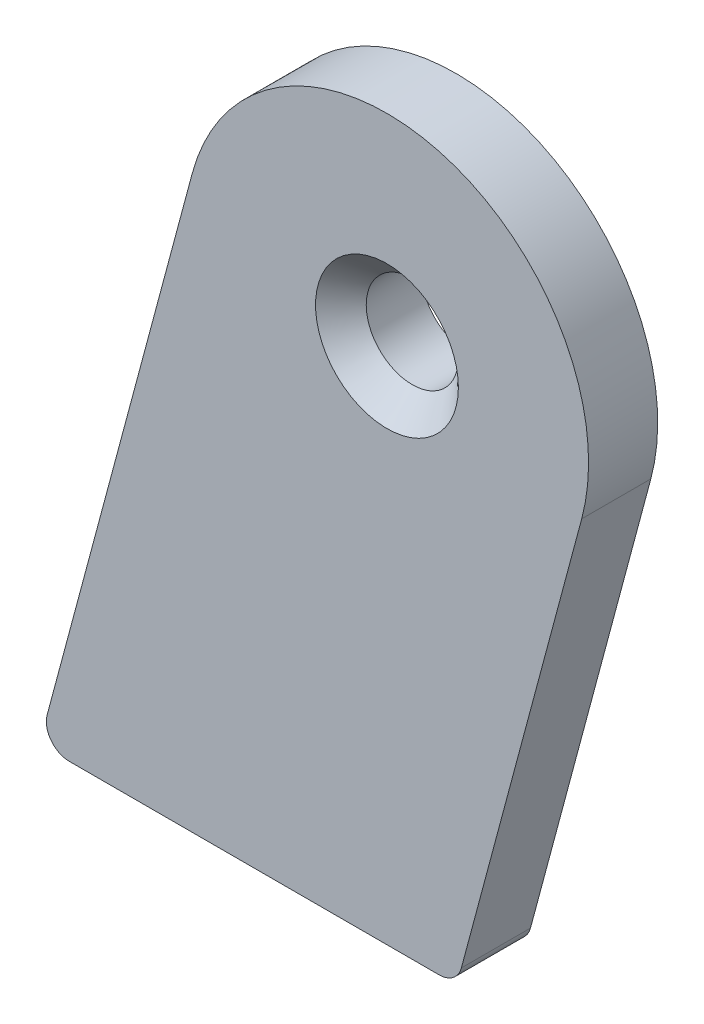
ISO-10303-21;
HEADER;
FILE_DESCRIPTION(('STEP AP214'),'2;1');
FILE_NAME('part.step','',(''),(''),'','','');
FILE_SCHEMA(('AUTOMOTIVE_DESIGN { 1 0 10303 214 1 1 1 1 }'));
ENDSEC;
DATA;
#1=APPLICATION_CONTEXT('core data for automotive mechanical design processes');
#2=APPLICATION_PROTOCOL_DEFINITION('international standard','automotive_design',2000,#1);
#3=PRODUCT_CONTEXT('',#1,'mechanical');
#4=PRODUCT('Part','Part','',(#3));
#5=PRODUCT_RELATED_PRODUCT_CATEGORY('part','',(#4));
#6=PRODUCT_DEFINITION_FORMATION('','',#4);
#7=PRODUCT_DEFINITION_CONTEXT('part definition',#1,'design');
#8=PRODUCT_DEFINITION('design','',#6,#7);
#9=PRODUCT_DEFINITION_SHAPE('','',#8);
#10=(LENGTH_UNIT() NAMED_UNIT(*) SI_UNIT(.MILLI.,.METRE.));
#11=(NAMED_UNIT(*) PLANE_ANGLE_UNIT() SI_UNIT($,.RADIAN.));
#12=(NAMED_UNIT(*) SI_UNIT($,.STERADIAN.) SOLID_ANGLE_UNIT());
#13=UNCERTAINTY_MEASURE_WITH_UNIT(LENGTH_MEASURE(1.E-05),#10,'distance_accuracy_value','');
#14=(GEOMETRIC_REPRESENTATION_CONTEXT(3) GLOBAL_UNCERTAINTY_ASSIGNED_CONTEXT((#13)) GLOBAL_UNIT_ASSIGNED_CONTEXT((#10,
#11,#12)) REPRESENTATION_CONTEXT('',''));
#15=CARTESIAN_POINT('',(0.,0.,0.));
#16=DIRECTION('',(0.,0.,1.));
#17=DIRECTION('',(1.,0.,0.));
#18=AXIS2_PLACEMENT_3D('',#15,#16,#17);
#19=CARTESIAN_POINT('',(46.,0.,28.));
#20=DIRECTION('',(0.,0.,-1.));
#21=DIRECTION('',(-1.,0.,0.));
#22=AXIS2_PLACEMENT_3D('',#19,#20,#21);
#23=PLANE('',#22);
#24=DIRECTION('',(0.258819045102514,0.96592582628907,0.));
#25=VECTOR('',#24,1.);
#26=CARTESIAN_POINT('',(58.0596194977762,-45.,28.));
#27=LINE('',#26,#25);
#28=CARTESIAN_POINT('',(58.4568171743964,-43.517638090205,28.));
#29=VERTEX_POINT('',#28);
#30=CARTESIAN_POINT('',(68.9037019600588,-4.529333289294,28.));
#31=VERTEX_POINT('',#30);
#32=EDGE_CURVE('E191',#29,#31,#27,.T.);
#33=ORIENTED_EDGE('',*,*,#32,.F.);
#34=CARTESIAN_POINT('',(56.5249655218183,-43.,28.));
#35=DIRECTION('',(0.,0.,-1.));
#36=DIRECTION('',(-1.,0.,0.));
#37=AXIS2_PLACEMENT_3D('',#34,#35,#36);
#38=CIRCLE('',#37,2.);
#39=CARTESIAN_POINT('',(56.5249655218183,-45.,28.));
#40=VERTEX_POINT('',#39);
#41=EDGE_CURVE('E221',#29,#40,#38,.T.);
#42=ORIENTED_EDGE('',*,*,#41,.T.);
#43=DIRECTION('',(1.,0.,0.));
#44=VECTOR('',#43,1.);
#45=CARTESIAN_POINT('',(21.8249531834234,-45.,28.));
#46=LINE('',#45,#44);
#47=CARTESIAN_POINT('',(24.4314039291058,-45.,28.));
#48=VERTEX_POINT('',#47);
#49=EDGE_CURVE('E301',#48,#40,#46,.T.);
#50=ORIENTED_EDGE('',*,*,#49,.F.);
#51=CARTESIAN_POINT('',(24.4314039291058,-43.,28.));
#52=DIRECTION('',(0.,0.,-1.));
#53=DIRECTION('',(-1.,0.,0.));
#54=AXIS2_PLACEMENT_3D('',#51,#52,#53);
#55=CIRCLE('',#54,2.);
#56=CARTESIAN_POINT('',(22.4995522765276,-42.482361909795,28.));
#57=VERTEX_POINT('',#56);
#58=EDGE_CURVE('E219',#48,#57,#55,.T.);
#59=ORIENTED_EDGE('',*,*,#58,.T.);
#60=DIRECTION('',(-0.258819045102514,-0.96592582628907,0.));
#61=VECTOR('',#60,1.);
#62=CARTESIAN_POINT('',(35.0962980399413,4.529333289294,28.));
#63=LINE('',#62,#61);
#64=CARTESIAN_POINT('',(35.0962980399413,4.529333289294,28.));
#65=VERTEX_POINT('',#64);
#66=EDGE_CURVE('E194',#65,#57,#63,.T.);
#67=ORIENTED_EDGE('',*,*,#66,.F.);
#68=CARTESIAN_POINT('',(52.,0.,28.));
#69=DIRECTION('',(0.,0.,-1.));
#70=DIRECTION('',(-1.,0.,0.));
#71=AXIS2_PLACEMENT_3D('',#68,#69,#70);
#72=CIRCLE('',#71,17.5);
#73=EDGE_CURVE('E164',#65,#31,#72,.T.);
#74=ORIENTED_EDGE('',*,*,#73,.T.);
#75=EDGE_LOOP('',(#33,#42,#50,#59,#67,#74));
#76=FACE_BOUND('',#75,.T.);
#77=CARTESIAN_POINT('',(52.,0.,28.));
#78=DIRECTION('',(0.,0.,-1.));
#79=DIRECTION('',(-1.,0.,0.));
#80=AXIS2_PLACEMENT_3D('',#77,#78,#79);
#81=CIRCLE('',#80,6.00000000000001);
#82=CARTESIAN_POINT('',(46.,0.,28.));
#83=VERTEX_POINT('',#82);
#84=EDGE_CURVE('E198',#83,#83,#81,.T.);
#85=ORIENTED_EDGE('',*,*,#84,.F.);
#86=EDGE_LOOP('',(#85));
#87=FACE_BOUND('',#86,.T.);
#88=DIRECTION('',(-0.60876142900872,0.793353340291236,0.));
#89=VECTOR('',#88,1.);
#90=CARTESIAN_POINT('',(59.155963733759,-12.6111927683755,28.));
#91=LINE('',#90,#89);
#92=CARTESIAN_POINT('',(58.886893794168,-12.2605339960317,28.));
#93=VERTEX_POINT('',#92);
#94=CARTESIAN_POINT('',(58.2743340974937,-11.4622306569458,28.));
#95=VERTEX_POINT('',#94);
#96=EDGE_CURVE('E270',#93,#95,#91,.T.);
#97=ORIENTED_EDGE('',*,*,#96,.F.);
#98=CARTESIAN_POINT('',(59.2835704643137,-11.9561532815274,28.));
#99=DIRECTION('',(0.,0.,-1.));
#100=DIRECTION('',(-1.,0.,0.));
#101=AXIS2_PLACEMENT_3D('',#98,#99,#100);
#102=CIRCLE('',#101,0.5);
#103=CARTESIAN_POINT('',(59.5436979808963,-12.3831587558676,28.));
#104=VERTEX_POINT('',#103);
#105=EDGE_CURVE('E257',#93,#104,#102,.F.);
#106=ORIENTED_EDGE('',*,*,#105,.T.);
#107=CARTESIAN_POINT('',(52.,0.,28.));
#108=DIRECTION('',(0.,0.,-1.));
#109=DIRECTION('',(-1.,0.,0.));
#110=AXIS2_PLACEMENT_3D('',#107,#108,#109);
#111=CIRCLE('',#110,14.5);
#112=CARTESIAN_POINT('',(62.0087601453726,-10.4916500300191,28.));
#113=VERTEX_POINT('',#112);
#114=EDGE_CURVE('E294',#113,#104,#111,.T.);
#115=ORIENTED_EDGE('',*,*,#114,.F.);
#116=CARTESIAN_POINT('',(61.6636304851874,-10.1298689945012,28.));
#117=DIRECTION('',(0.,0.,-1.));
#118=DIRECTION('',(-1.,0.,0.));
#119=AXIS2_PLACEMENT_3D('',#116,#117,#118);
#120=CIRCLE('',#119,0.5);
#121=CARTESIAN_POINT('',(62.060307155333,-9.82548827999685,28.));
#122=VERTEX_POINT('',#121);
#123=EDGE_CURVE('E11',#113,#122,#120,.F.);
#124=ORIENTED_EDGE('',*,*,#123,.T.);
#125=DIRECTION('',(0.60876142900872,-0.793353340291236,0.));
#126=VECTOR('',#125,1.);
#127=CARTESIAN_POINT('',(62.3293770949239,-10.1761470523406,28.));
#128=LINE('',#127,#126);
#129=CARTESIAN_POINT('',(61.4477474586586,-9.02718494091091,28.));
#130=VERTEX_POINT('',#129);
#131=EDGE_CURVE('E264',#130,#122,#128,.T.);
#132=ORIENTED_EDGE('',*,*,#131,.F.);
#133=CARTESIAN_POINT('',(61.051070788513,-9.33156565541528,28.));
#134=DIRECTION('',(0.,0.,-1.));
#135=DIRECTION('',(-1.,0.,0.));
#136=AXIS2_PLACEMENT_3D('',#133,#134,#135);
#137=CIRCLE('',#136,0.5);
#138=CARTESIAN_POINT('',(60.7029526812625,-8.97265928405315,28.));
#139=VERTEX_POINT('',#138);
#140=EDGE_CURVE('E55',#130,#139,#137,.F.);
#141=ORIENTED_EDGE('',*,*,#140,.T.);
#142=CARTESIAN_POINT('',(52.,0.,28.));
#143=DIRECTION('',(0.,0.,1.));
#144=DIRECTION('',(-1.,0.,0.));
#145=AXIS2_PLACEMENT_3D('',#142,#143,#144);
#146=CIRCLE('',#145,12.5);
#147=CARTESIAN_POINT('',(58.4144334304224,-10.7287018677321,28.));
#148=VERTEX_POINT('',#147);
#149=EDGE_CURVE('E263',#148,#139,#146,.T.);
#150=ORIENTED_EDGE('',*,*,#149,.F.);
#151=CARTESIAN_POINT('',(58.6710107676393,-11.1578499424414,28.));
#152=DIRECTION('',(0.,0.,-1.));
#153=DIRECTION('',(-1.,0.,0.));
#154=AXIS2_PLACEMENT_3D('',#151,#152,#153);
#155=CIRCLE('',#154,0.5);
#156=EDGE_CURVE('E259',#148,#95,#155,.F.);
#157=ORIENTED_EDGE('',*,*,#156,.T.);
#158=EDGE_LOOP('',(#97,#106,#115,#124,#132,#141,#150,#157));
#159=FACE_BOUND('',#158,.T.);
#160=ADVANCED_FACE('F47',(#76,#87,#159),#23,.T.);
#161=CARTESIAN_POINT('',(52.,0.,28.));
#162=DIRECTION('',(0.,0.,-1.));
#163=DIRECTION('',(-1.,0.,0.));
#164=AXIS2_PLACEMENT_3D('',#161,#162,#163);
#165=CYLINDRICAL_SURFACE('',#164,17.5);
#166=ORIENTED_EDGE('',*,*,#73,.F.);
#167=DIRECTION('',(0.,0.,1.));
#168=VECTOR('',#167,1.);
#169=CARTESIAN_POINT('',(35.0962980399413,4.529333289294,28.));
#170=LINE('',#169,#168);
#171=CARTESIAN_POINT('',(35.0962980399413,4.529333289294,34.));
#172=VERTEX_POINT('',#171);
#173=EDGE_CURVE('E165',#65,#172,#170,.T.);
#174=ORIENTED_EDGE('',*,*,#173,.T.);
#175=CARTESIAN_POINT('',(52.,0.,34.));
#176=DIRECTION('',(0.,0.,-1.));
#177=DIRECTION('',(-1.,0.,0.));
#178=AXIS2_PLACEMENT_3D('',#175,#176,#177);
#179=CIRCLE('',#178,17.5);
#180=CARTESIAN_POINT('',(68.9037019600587,-4.529333289294,34.));
#181=VERTEX_POINT('',#180);
#182=EDGE_CURVE('E153',#172,#181,#179,.T.);
#183=ORIENTED_EDGE('',*,*,#182,.T.);
#184=DIRECTION('',(0.,0.,1.));
#185=VECTOR('',#184,1.);
#186=CARTESIAN_POINT('',(68.9037019600587,-4.529333289294,28.));
#187=LINE('',#186,#185);
#188=EDGE_CURVE('E173',#31,#181,#187,.T.);
#189=ORIENTED_EDGE('',*,*,#188,.F.);
#190=EDGE_LOOP('',(#166,#174,#183,#189));
#191=FACE_BOUND('',#190,.T.);
#192=ADVANCED_FACE('F168',(#191),#165,.T.);
#193=CARTESIAN_POINT('',(48.,0.,27.));
#194=DIRECTION('',(0.,0.,-1.));
#195=DIRECTION('',(-1.,0.,0.));
#196=AXIS2_PLACEMENT_3D('',#193,#194,#195);
#197=PLANE('',#196);
#198=CARTESIAN_POINT('',(52.,0.,27.));
#199=DIRECTION('',(0.,0.,-1.));
#200=DIRECTION('',(-1.,0.,0.));
#201=AXIS2_PLACEMENT_3D('',#198,#199,#200);
#202=CIRCLE('',#201,6.00000000000001);
#203=CARTESIAN_POINT('',(46.,0.,27.));
#204=VERTEX_POINT('',#203);
#205=EDGE_CURVE('E201',#204,#204,#202,.T.);
#206=ORIENTED_EDGE('',*,*,#205,.T.);
#207=EDGE_LOOP('',(#206));
#208=FACE_BOUND('',#207,.T.);
#209=CARTESIAN_POINT('',(52.,0.,27.));
#210=DIRECTION('',(0.,0.,-1.));
#211=DIRECTION('',(-1.,0.,0.));
#212=AXIS2_PLACEMENT_3D('',#209,#210,#211);
#213=CIRCLE('',#212,4.00000000000001);
#214=CARTESIAN_POINT('',(48.,0.,27.));
#215=VERTEX_POINT('',#214);
#216=EDGE_CURVE('E204',#215,#215,#213,.T.);
#217=ORIENTED_EDGE('',*,*,#216,.F.);
#218=EDGE_LOOP('',(#217));
#219=FACE_BOUND('',#218,.T.);
#220=ADVANCED_FACE('F337',(#208,#219),#197,.T.);
#221=CARTESIAN_POINT('',(52.,0.,28.));
#222=DIRECTION('',(0.,0.,-1.));
#223=DIRECTION('',(-1.,0.,0.));
#224=AXIS2_PLACEMENT_3D('',#221,#222,#223);
#225=CYLINDRICAL_SURFACE('',#224,6.00000000000001);
#226=ORIENTED_EDGE('',*,*,#84,.T.);
#227=EDGE_LOOP('',(#226));
#228=FACE_BOUND('',#227,.T.);
#229=ORIENTED_EDGE('',*,*,#205,.F.);
#230=EDGE_LOOP('',(#229));
#231=FACE_BOUND('',#230,.T.);
#232=ADVANCED_FACE('F341',(#228,#231),#225,.T.);
#233=CARTESIAN_POINT('',(34.5,0.,34.));
#234=DIRECTION('',(0.,0.,1.));
#235=DIRECTION('',(1.,0.,0.));
#236=AXIS2_PLACEMENT_3D('',#233,#234,#235);
#237=PLANE('',#236);
#238=CARTESIAN_POINT('',(52.,0.,34.));
#239=DIRECTION('',(0.,0.,1.));
#240=DIRECTION('',(1.,0.,0.));
#241=AXIS2_PLACEMENT_3D('',#238,#239,#240);
#242=CIRCLE('',#241,6.2);
#243=CARTESIAN_POINT('',(58.2,0.,34.));
#244=VERTEX_POINT('',#243);
#245=EDGE_CURVE('E188',#244,#244,#242,.T.);
#246=ORIENTED_EDGE('',*,*,#245,.F.);
#247=EDGE_LOOP('',(#246));
#248=FACE_BOUND('',#247,.T.);
#249=DIRECTION('',(1.,0.,0.));
#250=VECTOR('',#249,1.);
#251=CARTESIAN_POINT('',(21.8249531834234,-45.,34.));
#252=LINE('',#251,#250);
#253=CARTESIAN_POINT('',(24.4314039291058,-45.,34.));
#254=VERTEX_POINT('',#253);
#255=CARTESIAN_POINT('',(56.5249655218183,-45.,34.));
#256=VERTEX_POINT('',#255);
#257=EDGE_CURVE('E180',#254,#256,#252,.T.);
#258=ORIENTED_EDGE('',*,*,#257,.T.);
#259=CARTESIAN_POINT('',(56.5249655218183,-43.,34.));
#260=DIRECTION('',(0.,0.,1.));
#261=DIRECTION('',(1.,0.,0.));
#262=AXIS2_PLACEMENT_3D('',#259,#260,#261);
#263=CIRCLE('',#262,2.);
#264=CARTESIAN_POINT('',(58.4568171743964,-43.517638090205,34.));
#265=VERTEX_POINT('',#264);
#266=EDGE_CURVE('E215',#256,#265,#263,.T.);
#267=ORIENTED_EDGE('',*,*,#266,.T.);
#268=DIRECTION('',(0.258819045102514,0.96592582628907,0.));
#269=VECTOR('',#268,1.);
#270=CARTESIAN_POINT('',(58.0596194977762,-45.,34.));
#271=LINE('',#270,#269);
#272=EDGE_CURVE('E160',#265,#181,#271,.T.);
#273=ORIENTED_EDGE('',*,*,#272,.T.);
#274=ORIENTED_EDGE('',*,*,#182,.F.);
#275=DIRECTION('',(-0.258819045102514,-0.96592582628907,0.));
#276=VECTOR('',#275,1.);
#277=CARTESIAN_POINT('',(35.0962980399413,4.529333289294,34.));
#278=LINE('',#277,#276);
#279=CARTESIAN_POINT('',(22.4995522765276,-42.482361909795,34.));
#280=VERTEX_POINT('',#279);
#281=EDGE_CURVE('E158',#172,#280,#278,.T.);
#282=ORIENTED_EDGE('',*,*,#281,.T.);
#283=CARTESIAN_POINT('',(24.4314039291058,-43.,34.));
#284=DIRECTION('',(0.,0.,1.));
#285=DIRECTION('',(1.,0.,0.));
#286=AXIS2_PLACEMENT_3D('',#283,#284,#285);
#287=CIRCLE('',#286,2.);
#288=EDGE_CURVE('E212',#280,#254,#287,.T.);
#289=ORIENTED_EDGE('',*,*,#288,.T.);
#290=EDGE_LOOP('',(#258,#267,#273,#274,#282,#289));
#291=FACE_BOUND('',#290,.T.);
#292=ADVANCED_FACE('F156',(#248,#291),#237,.T.);
#293=CARTESIAN_POINT('',(52.,0.,28.));
#294=DIRECTION('',(0.,0.,-1.));
#295=DIRECTION('',(-1.,0.,0.));
#296=AXIS2_PLACEMENT_3D('',#293,#294,#295);
#297=CYLINDRICAL_SURFACE('',#296,4.00000000000001);
#298=CARTESIAN_POINT('',(52.,0.,31.8));
#299=DIRECTION('',(0.,0.,1.));
#300=DIRECTION('',(1.,0.,0.));
#301=AXIS2_PLACEMENT_3D('',#298,#299,#300);
#302=CIRCLE('',#301,4.00000000000001);
#303=CARTESIAN_POINT('',(56.,0.,31.8));
#304=VERTEX_POINT('',#303);
#305=EDGE_CURVE('E181',#304,#304,#302,.F.);
#306=ORIENTED_EDGE('',*,*,#305,.F.);
#307=EDGE_LOOP('',(#306));
#308=FACE_BOUND('',#307,.T.);
#309=ORIENTED_EDGE('',*,*,#216,.T.);
#310=EDGE_LOOP('',(#309));
#311=FACE_BOUND('',#310,.T.);
#312=ADVANCED_FACE('F352',(#308,#311),#297,.F.);
#313=CARTESIAN_POINT('',(35.0962980399413,4.529333289294,28.));
#314=DIRECTION('',(-0.96592582628907,0.258819045102514,0.));
#315=DIRECTION('',(-0.258819045102514,-0.96592582628907,0.));
#316=AXIS2_PLACEMENT_3D('',#313,#314,#315);
#317=PLANE('',#316);
#318=ORIENTED_EDGE('',*,*,#66,.T.);
#319=DIRECTION('',(0.,0.,1.));
#320=VECTOR('',#319,1.);
#321=CARTESIAN_POINT('',(22.4995522765276,-42.482361909795,28.));
#322=LINE('',#321,#320);
#323=EDGE_CURVE('E178',#57,#280,#322,.T.);
#324=ORIENTED_EDGE('',*,*,#323,.T.);
#325=ORIENTED_EDGE('',*,*,#281,.F.);
#326=ORIENTED_EDGE('',*,*,#173,.F.);
#327=EDGE_LOOP('',(#318,#324,#325,#326));
#328=FACE_BOUND('',#327,.T.);
#329=ADVANCED_FACE('F176',(#328),#317,.T.);
#330=CARTESIAN_POINT('',(58.0596194977762,-45.,28.));
#331=DIRECTION('',(0.96592582628907,-0.258819045102514,0.));
#332=DIRECTION('',(0.258819045102514,0.96592582628907,0.));
#333=AXIS2_PLACEMENT_3D('',#330,#331,#332);
#334=PLANE('',#333);
#335=ORIENTED_EDGE('',*,*,#272,.F.);
#336=DIRECTION('',(0.,0.,1.));
#337=VECTOR('',#336,1.);
#338=CARTESIAN_POINT('',(58.4568171743964,-43.517638090205,28.));
#339=LINE('',#338,#337);
#340=EDGE_CURVE('E217',#265,#29,#339,.F.);
#341=ORIENTED_EDGE('',*,*,#340,.T.);
#342=ORIENTED_EDGE('',*,*,#32,.T.);
#343=ORIENTED_EDGE('',*,*,#188,.T.);
#344=EDGE_LOOP('',(#335,#341,#342,#343));
#345=FACE_BOUND('',#344,.T.);
#346=ADVANCED_FACE('F309',(#345),#334,.T.);
#347=CARTESIAN_POINT('',(21.8249531834234,-45.,28.));
#348=DIRECTION('',(0.,-1.,0.));
#349=DIRECTION('',(0.,0.,-1.));
#350=AXIS2_PLACEMENT_3D('',#347,#348,#349);
#351=PLANE('',#350);
#352=ORIENTED_EDGE('',*,*,#49,.T.);
#353=DIRECTION('',(0.,0.,1.));
#354=VECTOR('',#353,1.);
#355=CARTESIAN_POINT('',(56.5249655218183,-45.,28.));
#356=LINE('',#355,#354);
#357=EDGE_CURVE('E209',#40,#256,#356,.T.);
#358=ORIENTED_EDGE('',*,*,#357,.T.);
#359=ORIENTED_EDGE('',*,*,#257,.F.);
#360=DIRECTION('',(0.,0.,1.));
#361=VECTOR('',#360,1.);
#362=CARTESIAN_POINT('',(24.4314039291058,-45.,28.));
#363=LINE('',#362,#361);
#364=EDGE_CURVE('E207',#254,#48,#363,.F.);
#365=ORIENTED_EDGE('',*,*,#364,.T.);
#366=EDGE_LOOP('',(#352,#358,#359,#365));
#367=FACE_BOUND('',#366,.T.);
#368=ADVANCED_FACE('F319',(#367),#351,.T.);
#369=CARTESIAN_POINT('',(56.5249655218183,-43.,28.));
#370=DIRECTION('',(0.,0.,1.));
#371=DIRECTION('',(1.,0.,0.));
#372=AXIS2_PLACEMENT_3D('',#369,#370,#371);
#373=CYLINDRICAL_SURFACE('',#372,2.);
#374=ORIENTED_EDGE('',*,*,#41,.F.);
#375=ORIENTED_EDGE('',*,*,#340,.F.);
#376=ORIENTED_EDGE('',*,*,#266,.F.);
#377=ORIENTED_EDGE('',*,*,#357,.F.);
#378=EDGE_LOOP('',(#374,#375,#376,#377));
#379=FACE_BOUND('',#378,.T.);
#380=ADVANCED_FACE('F321',(#379),#373,.T.);
#381=CARTESIAN_POINT('',(24.4314039291058,-43.,28.));
#382=DIRECTION('',(0.,0.,1.));
#383=DIRECTION('',(1.,0.,0.));
#384=AXIS2_PLACEMENT_3D('',#381,#382,#383);
#385=CYLINDRICAL_SURFACE('',#384,2.);
#386=ORIENTED_EDGE('',*,*,#58,.F.);
#387=ORIENTED_EDGE('',*,*,#364,.F.);
#388=ORIENTED_EDGE('',*,*,#288,.F.);
#389=ORIENTED_EDGE('',*,*,#323,.F.);
#390=EDGE_LOOP('',(#386,#387,#388,#389));
#391=FACE_BOUND('',#390,.T.);
#392=ADVANCED_FACE('F316',(#391),#385,.T.);
#393=CARTESIAN_POINT('',(52.,0.,34.));
#394=DIRECTION('',(0.,0.,1.));
#395=DIRECTION('',(1.,0.,0.));
#396=AXIS2_PLACEMENT_3D('',#393,#394,#395);
#397=CONICAL_SURFACE('',#396,6.2,0.785398163397448);
#398=ORIENTED_EDGE('',*,*,#305,.T.);
#399=EDGE_LOOP('',(#398));
#400=FACE_BOUND('',#399,.T.);
#401=ORIENTED_EDGE('',*,*,#245,.T.);
#402=EDGE_LOOP('',(#401));
#403=FACE_BOUND('',#402,.T.);
#404=ADVANCED_FACE('F328',(#400,#403),#397,.F.);
#405=CARTESIAN_POINT('',(52.,0.,24.5));
#406=DIRECTION('',(0.,0.,1.));
#407=DIRECTION('',(1.,0.,0.));
#408=AXIS2_PLACEMENT_3D('',#405,#406,#407);
#409=CYLINDRICAL_SURFACE('',#408,14.5);
#410=ORIENTED_EDGE('',*,*,#114,.T.);
#411=DIRECTION('',(0.,0.,1.));
#412=VECTOR('',#411,1.);
#413=CARTESIAN_POINT('',(59.5436979808963,-12.3831587558676,24.5));
#414=LINE('',#413,#412);
#415=CARTESIAN_POINT('',(59.5436979808963,-12.3831587558676,24.5));
#416=VERTEX_POINT('',#415);
#417=EDGE_CURVE('E233',#104,#416,#414,.F.);
#418=ORIENTED_EDGE('',*,*,#417,.T.);
#419=CARTESIAN_POINT('',(52.,0.,24.5));
#420=DIRECTION('',(0.,0.,-1.));
#421=DIRECTION('',(-1.,0.,0.));
#422=AXIS2_PLACEMENT_3D('',#419,#420,#421);
#423=CIRCLE('',#422,14.5);
#424=CARTESIAN_POINT('',(62.0087601453726,-10.4916500300191,24.5));
#425=VERTEX_POINT('',#424);
#426=EDGE_CURVE('E299',#425,#416,#423,.T.);
#427=ORIENTED_EDGE('',*,*,#426,.F.);
#428=DIRECTION('',(0.,0.,1.));
#429=VECTOR('',#428,1.);
#430=CARTESIAN_POINT('',(62.0087601453726,-10.4916500300191,24.5));
#431=LINE('',#430,#429);
#432=EDGE_CURVE('E229',#425,#113,#431,.T.);
#433=ORIENTED_EDGE('',*,*,#432,.T.);
#434=EDGE_LOOP('',(#410,#418,#427,#433));
#435=FACE_BOUND('',#434,.T.);
#436=ADVANCED_FACE('F368',(#435),#409,.T.);
#437=CARTESIAN_POINT('',(59.155963733759,-12.6111927683755,24.5));
#438=DIRECTION('',(0.793353340291236,0.60876142900872,0.));
#439=DIRECTION('',(-0.60876142900872,0.793353340291236,0.));
#440=AXIS2_PLACEMENT_3D('',#437,#438,#439);
#441=PLANE('',#440);
#442=DIRECTION('',(-0.60876142900872,0.793353340291236,0.));
#443=VECTOR('',#442,1.);
#444=CARTESIAN_POINT('',(59.155963733759,-12.6111927683755,24.5));
#445=LINE('',#444,#443);
#446=CARTESIAN_POINT('',(58.886893794168,-12.2605339960317,24.5));
#447=VERTEX_POINT('',#446);
#448=CARTESIAN_POINT('',(58.2743340974937,-11.4622306569458,24.5));
#449=VERTEX_POINT('',#448);
#450=EDGE_CURVE('E290',#447,#449,#445,.T.);
#451=ORIENTED_EDGE('',*,*,#450,.F.);
#452=DIRECTION('',(0.,0.,1.));
#453=VECTOR('',#452,1.);
#454=CARTESIAN_POINT('',(58.886893794168,-12.2605339960317,24.5));
#455=LINE('',#454,#453);
#456=EDGE_CURVE('E226',#447,#93,#455,.T.);
#457=ORIENTED_EDGE('',*,*,#456,.T.);
#458=ORIENTED_EDGE('',*,*,#96,.T.);
#459=DIRECTION('',(0.,0.,1.));
#460=VECTOR('',#459,1.);
#461=CARTESIAN_POINT('',(58.2743340974937,-11.4622306569458,24.5));
#462=LINE('',#461,#460);
#463=EDGE_CURVE('E224',#95,#449,#462,.F.);
#464=ORIENTED_EDGE('',*,*,#463,.T.);
#465=EDGE_LOOP('',(#451,#457,#458,#464));
#466=FACE_BOUND('',#465,.T.);
#467=ADVANCED_FACE('F372',(#466),#441,.F.);
#468=CARTESIAN_POINT('',(52.,0.,24.5));
#469=DIRECTION('',(0.,0.,1.));
#470=DIRECTION('',(1.,0.,0.));
#471=AXIS2_PLACEMENT_3D('',#468,#469,#470);
#472=CYLINDRICAL_SURFACE('',#471,12.5);
#473=CARTESIAN_POINT('',(52.,0.,24.5));
#474=DIRECTION('',(0.,0.,1.));
#475=DIRECTION('',(-1.,0.,0.));
#476=AXIS2_PLACEMENT_3D('',#473,#474,#475);
#477=CIRCLE('',#476,12.5);
#478=CARTESIAN_POINT('',(58.4144334304224,-10.7287018677321,24.5));
#479=VERTEX_POINT('',#478);
#480=CARTESIAN_POINT('',(60.7029526812625,-8.97265928405315,24.5));
#481=VERTEX_POINT('',#480);
#482=EDGE_CURVE('E281',#479,#481,#477,.T.);
#483=ORIENTED_EDGE('',*,*,#482,.F.);
#484=DIRECTION('',(0.,0.,1.));
#485=VECTOR('',#484,1.);
#486=CARTESIAN_POINT('',(58.4144334304224,-10.7287018677321,24.5));
#487=LINE('',#486,#485);
#488=EDGE_CURVE('E248',#479,#148,#487,.T.);
#489=ORIENTED_EDGE('',*,*,#488,.T.);
#490=ORIENTED_EDGE('',*,*,#149,.T.);
#491=DIRECTION('',(0.,0.,1.));
#492=VECTOR('',#491,1.);
#493=CARTESIAN_POINT('',(60.7029526812625,-8.97265928405315,24.5));
#494=LINE('',#493,#492);
#495=EDGE_CURVE('E245',#139,#481,#494,.F.);
#496=ORIENTED_EDGE('',*,*,#495,.T.);
#497=EDGE_LOOP('',(#483,#489,#490,#496));
#498=FACE_BOUND('',#497,.T.);
#499=ADVANCED_FACE('F267',(#498),#472,.F.);
#500=CARTESIAN_POINT('',(62.3293770949239,-10.1761470523406,24.5));
#501=DIRECTION('',(-0.793353340291236,-0.60876142900872,0.));
#502=DIRECTION('',(0.60876142900872,-0.793353340291236,0.));
#503=AXIS2_PLACEMENT_3D('',#500,#501,#502);
#504=PLANE('',#503);
#505=DIRECTION('',(0.60876142900872,-0.793353340291236,0.));
#506=VECTOR('',#505,1.);
#507=CARTESIAN_POINT('',(62.3293770949239,-10.1761470523406,24.5));
#508=LINE('',#507,#506);
#509=CARTESIAN_POINT('',(61.4477474586586,-9.02718494091091,24.5));
#510=VERTEX_POINT('',#509);
#511=CARTESIAN_POINT('',(62.060307155333,-9.82548827999685,24.5));
#512=VERTEX_POINT('',#511);
#513=EDGE_CURVE('E279',#510,#512,#508,.T.);
#514=ORIENTED_EDGE('',*,*,#513,.F.);
#515=DIRECTION('',(0.,0.,1.));
#516=VECTOR('',#515,1.);
#517=CARTESIAN_POINT('',(61.4477474586586,-9.02718494091091,24.5));
#518=LINE('',#517,#516);
#519=EDGE_CURVE('E254',#510,#130,#518,.T.);
#520=ORIENTED_EDGE('',*,*,#519,.T.);
#521=ORIENTED_EDGE('',*,*,#131,.T.);
#522=DIRECTION('',(0.,0.,1.));
#523=VECTOR('',#522,1.);
#524=CARTESIAN_POINT('',(62.060307155333,-9.82548827999685,24.5));
#525=LINE('',#524,#523);
#526=EDGE_CURVE('E251',#122,#512,#525,.F.);
#527=ORIENTED_EDGE('',*,*,#526,.T.);
#528=EDGE_LOOP('',(#514,#520,#521,#527));
#529=FACE_BOUND('',#528,.T.);
#530=ADVANCED_FACE('F283',(#529),#504,.F.);
#531=CARTESIAN_POINT('',(52.,0.,24.5));
#532=DIRECTION('',(0.,0.,-1.));
#533=DIRECTION('',(-1.,0.,0.));
#534=AXIS2_PLACEMENT_3D('',#531,#532,#533);
#535=PLANE('',#534);
#536=ORIENTED_EDGE('',*,*,#426,.T.);
#537=CARTESIAN_POINT('',(59.2835704643137,-11.9561532815274,24.5));
#538=DIRECTION('',(0.,0.,-1.));
#539=DIRECTION('',(-1.,0.,0.));
#540=AXIS2_PLACEMENT_3D('',#537,#538,#539);
#541=CIRCLE('',#540,0.5);
#542=EDGE_CURVE('E243',#416,#447,#541,.T.);
#543=ORIENTED_EDGE('',*,*,#542,.T.);
#544=ORIENTED_EDGE('',*,*,#450,.T.);
#545=CARTESIAN_POINT('',(58.6710107676393,-11.1578499424414,24.5));
#546=DIRECTION('',(0.,0.,-1.));
#547=DIRECTION('',(-1.,0.,0.));
#548=AXIS2_PLACEMENT_3D('',#545,#546,#547);
#549=CIRCLE('',#548,0.5);
#550=EDGE_CURVE('E241',#449,#479,#549,.T.);
#551=ORIENTED_EDGE('',*,*,#550,.T.);
#552=ORIENTED_EDGE('',*,*,#482,.T.);
#553=CARTESIAN_POINT('',(61.051070788513,-9.33156565541528,24.5));
#554=DIRECTION('',(0.,0.,-1.));
#555=DIRECTION('',(-1.,0.,0.));
#556=AXIS2_PLACEMENT_3D('',#553,#554,#555);
#557=CIRCLE('',#556,0.5);
#558=EDGE_CURVE('E238',#481,#510,#557,.T.);
#559=ORIENTED_EDGE('',*,*,#558,.T.);
#560=ORIENTED_EDGE('',*,*,#513,.T.);
#561=CARTESIAN_POINT('',(61.6636304851874,-10.1298689945012,24.5));
#562=DIRECTION('',(0.,0.,-1.));
#563=DIRECTION('',(-1.,0.,0.));
#564=AXIS2_PLACEMENT_3D('',#561,#562,#563);
#565=CIRCLE('',#564,0.5);
#566=EDGE_CURVE('E235',#512,#425,#565,.T.);
#567=ORIENTED_EDGE('',*,*,#566,.T.);
#568=EDGE_LOOP('',(#536,#543,#544,#551,#552,#559,#560,#567));
#569=FACE_BOUND('',#568,.T.);
#570=ADVANCED_FACE('F278',(#569),#535,.T.);
#571=CARTESIAN_POINT('',(59.2835704643137,-11.9561532815274,24.5));
#572=DIRECTION('',(0.,0.,1.));
#573=DIRECTION('',(1.,0.,0.));
#574=AXIS2_PLACEMENT_3D('',#571,#572,#573);
#575=CYLINDRICAL_SURFACE('',#574,0.5);
#576=ORIENTED_EDGE('',*,*,#542,.F.);
#577=ORIENTED_EDGE('',*,*,#417,.F.);
#578=ORIENTED_EDGE('',*,*,#105,.F.);
#579=ORIENTED_EDGE('',*,*,#456,.F.);
#580=EDGE_LOOP('',(#576,#577,#578,#579));
#581=FACE_BOUND('',#580,.T.);
#582=ADVANCED_FACE('F382',(#581),#575,.T.);
#583=CARTESIAN_POINT('',(58.6710107676393,-11.1578499424414,24.5));
#584=DIRECTION('',(0.,0.,1.));
#585=DIRECTION('',(1.,0.,0.));
#586=AXIS2_PLACEMENT_3D('',#583,#584,#585);
#587=CYLINDRICAL_SURFACE('',#586,0.5);
#588=ORIENTED_EDGE('',*,*,#550,.F.);
#589=ORIENTED_EDGE('',*,*,#463,.F.);
#590=ORIENTED_EDGE('',*,*,#156,.F.);
#591=ORIENTED_EDGE('',*,*,#488,.F.);
#592=EDGE_LOOP('',(#588,#589,#590,#591));
#593=FACE_BOUND('',#592,.T.);
#594=ADVANCED_FACE('F386',(#593),#587,.T.);
#595=CARTESIAN_POINT('',(61.051070788513,-9.33156565541528,24.5));
#596=DIRECTION('',(0.,0.,1.));
#597=DIRECTION('',(1.,0.,0.));
#598=AXIS2_PLACEMENT_3D('',#595,#596,#597);
#599=CYLINDRICAL_SURFACE('',#598,0.5);
#600=ORIENTED_EDGE('',*,*,#558,.F.);
#601=ORIENTED_EDGE('',*,*,#495,.F.);
#602=ORIENTED_EDGE('',*,*,#140,.F.);
#603=ORIENTED_EDGE('',*,*,#519,.F.);
#604=EDGE_LOOP('',(#600,#601,#602,#603));
#605=FACE_BOUND('',#604,.T.);
#606=ADVANCED_FACE('F273',(#605),#599,.T.);
#607=CARTESIAN_POINT('',(61.6636304851874,-10.1298689945012,24.5));
#608=DIRECTION('',(0.,0.,1.));
#609=DIRECTION('',(1.,0.,0.));
#610=AXIS2_PLACEMENT_3D('',#607,#608,#609);
#611=CYLINDRICAL_SURFACE('',#610,0.5);
#612=ORIENTED_EDGE('',*,*,#566,.F.);
#613=ORIENTED_EDGE('',*,*,#526,.F.);
#614=ORIENTED_EDGE('',*,*,#123,.F.);
#615=ORIENTED_EDGE('',*,*,#432,.F.);
#616=EDGE_LOOP('',(#612,#613,#614,#615));
#617=FACE_BOUND('',#616,.T.);
#618=ADVANCED_FACE('F49',(#617),#611,.T.);
#619=CLOSED_SHELL('',(#160,#192,#220,#232,#292,#312,#329,#346,#368,#380,#392,#404,#436,#467,
#499,#530,#570,#582,#594,#606,#618));
#620=MANIFOLD_SOLID_BREP('B2',#619);
#621=ADVANCED_BREP_SHAPE_REPRESENTATION('',(#18,#620),#14);
#622=SHAPE_DEFINITION_REPRESENTATION(#9,#621);
ENDSEC;
END-ISO-10303-21;
